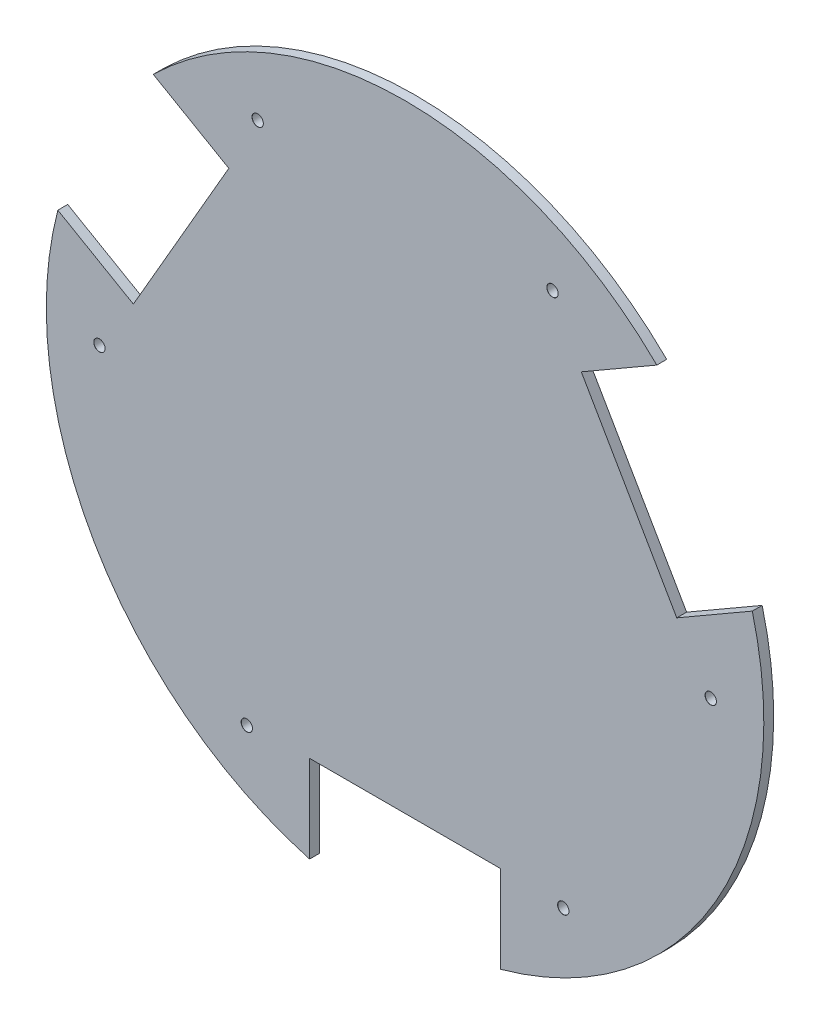
ISO-10303-21;
HEADER;
FILE_DESCRIPTION(('STEP AP214'),'2;1');
FILE_NAME('part.step','',(''),(''),'','','');
FILE_SCHEMA(('AUTOMOTIVE_DESIGN { 1 0 10303 214 1 1 1 1 }'));
ENDSEC;
DATA;
#1=APPLICATION_CONTEXT('core data for automotive mechanical design processes');
#2=APPLICATION_PROTOCOL_DEFINITION('international standard','automotive_design',2000,#1);
#3=PRODUCT_CONTEXT('',#1,'mechanical');
#4=PRODUCT('Part','Part','',(#3));
#5=PRODUCT_RELATED_PRODUCT_CATEGORY('part','',(#4));
#6=PRODUCT_DEFINITION_FORMATION('','',#4);
#7=PRODUCT_DEFINITION_CONTEXT('part definition',#1,'design');
#8=PRODUCT_DEFINITION('design','',#6,#7);
#9=PRODUCT_DEFINITION_SHAPE('','',#8);
#10=(LENGTH_UNIT() NAMED_UNIT(*) SI_UNIT(.MILLI.,.METRE.));
#11=(NAMED_UNIT(*) PLANE_ANGLE_UNIT() SI_UNIT($,.RADIAN.));
#12=(NAMED_UNIT(*) SI_UNIT($,.STERADIAN.) SOLID_ANGLE_UNIT());
#13=UNCERTAINTY_MEASURE_WITH_UNIT(LENGTH_MEASURE(1.E-05),#10,'distance_accuracy_value','');
#14=(GEOMETRIC_REPRESENTATION_CONTEXT(3) GLOBAL_UNCERTAINTY_ASSIGNED_CONTEXT((#13)) GLOBAL_UNIT_ASSIGNED_CONTEXT((#10,
#11,#12)) REPRESENTATION_CONTEXT('',''));
#15=CARTESIAN_POINT('',(0.,0.,0.));
#16=DIRECTION('',(0.,0.,1.));
#17=DIRECTION('',(1.,0.,0.));
#18=AXIS2_PLACEMENT_3D('',#15,#16,#17);
#19=CARTESIAN_POINT('',(0.,0.,3.));
#20=DIRECTION('',(0.,0.,-1.));
#21=DIRECTION('',(-1.,0.,0.));
#22=AXIS2_PLACEMENT_3D('',#19,#20,#21);
#23=CYLINDRICAL_SURFACE('',#22,109.);
#24=CARTESIAN_POINT('',(0.,0.,0.));
#25=DIRECTION('',(0.,0.,1.));
#26=DIRECTION('',(1.,0.,0.));
#27=AXIS2_PLACEMENT_3D('',#24,#25,#26);
#28=CIRCLE('',#27,109.);
#29=CARTESIAN_POINT('',(-105.494505328619,27.4209654365062,0.));
#30=VERTEX_POINT('',#29);
#31=CARTESIAN_POINT('',(-29.,-105.07140429251,0.));
#32=VERTEX_POINT('',#31);
#33=EDGE_CURVE('E245',#30,#32,#28,.T.);
#34=ORIENTED_EDGE('',*,*,#33,.T.);
#35=DIRECTION('',(0.,0.,-1.));
#36=VECTOR('',#35,1.);
#37=CARTESIAN_POINT('',(-29.,-105.07140429251,3.));
#38=LINE('',#37,#36);
#39=CARTESIAN_POINT('',(-29.,-105.07140429251,3.));
#40=VERTEX_POINT('',#39);
#41=EDGE_CURVE('E143',#32,#40,#38,.F.);
#42=ORIENTED_EDGE('',*,*,#41,.T.);
#43=CARTESIAN_POINT('',(0.,0.,3.));
#44=DIRECTION('',(0.,0.,1.));
#45=DIRECTION('',(1.,0.,0.));
#46=AXIS2_PLACEMENT_3D('',#43,#44,#45);
#47=CIRCLE('',#46,109.);
#48=CARTESIAN_POINT('',(-105.494505328619,27.4209654365062,3.));
#49=VERTEX_POINT('',#48);
#50=EDGE_CURVE('E239',#49,#40,#47,.T.);
#51=ORIENTED_EDGE('',*,*,#50,.F.);
#52=DIRECTION('',(0.,0.,-1.));
#53=VECTOR('',#52,1.);
#54=CARTESIAN_POINT('',(-105.494505328619,27.4209654365062,3.));
#55=LINE('',#54,#53);
#56=EDGE_CURVE('E220',#49,#30,#55,.T.);
#57=ORIENTED_EDGE('',*,*,#56,.T.);
#58=EDGE_LOOP('',(#34,#42,#51,#57));
#59=FACE_BOUND('',#58,.T.);
#60=ADVANCED_FACE('F38',(#59),#23,.T.);
#61=CARTESIAN_POINT('',(76.4945053286188,77.6504388560033,0.));
#62=VERTEX_POINT('',#61);
#63=CARTESIAN_POINT('',(-76.4945053286185,77.6504388560036,0.));
#64=VERTEX_POINT('',#63);
#65=EDGE_CURVE('E240',#62,#64,#28,.T.);
#66=ORIENTED_EDGE('',*,*,#65,.T.);
#67=DIRECTION('',(0.,0.,-1.));
#68=VECTOR('',#67,1.);
#69=CARTESIAN_POINT('',(-76.4945053286185,77.6504388560036,3.));
#70=LINE('',#69,#68);
#71=CARTESIAN_POINT('',(-76.4945053286185,77.6504388560036,3.));
#72=VERTEX_POINT('',#71);
#73=EDGE_CURVE('E224',#64,#72,#70,.F.);
#74=ORIENTED_EDGE('',*,*,#73,.T.);
#75=CARTESIAN_POINT('',(76.4945053286188,77.6504388560033,3.));
#76=VERTEX_POINT('',#75);
#77=EDGE_CURVE('E241',#76,#72,#47,.T.);
#78=ORIENTED_EDGE('',*,*,#77,.F.);
#79=DIRECTION('',(0.,0.,-1.));
#80=VECTOR('',#79,1.);
#81=CARTESIAN_POINT('',(76.4945053286188,77.6504388560033,3.));
#82=LINE('',#81,#80);
#83=EDGE_CURVE('E136',#76,#62,#82,.T.);
#84=ORIENTED_EDGE('',*,*,#83,.T.);
#85=EDGE_LOOP('',(#66,#74,#78,#84));
#86=FACE_BOUND('',#85,.T.);
#87=ADVANCED_FACE('F269',(#86),#23,.T.);
#88=CARTESIAN_POINT('',(29.,-105.07140429251,3.));
#89=VERTEX_POINT('',#88);
#90=CARTESIAN_POINT('',(105.494505328619,27.4209654365058,3.));
#91=VERTEX_POINT('',#90);
#92=EDGE_CURVE('E235',#89,#91,#47,.T.);
#93=ORIENTED_EDGE('',*,*,#92,.F.);
#94=DIRECTION('',(0.,0.,-1.));
#95=VECTOR('',#94,1.);
#96=CARTESIAN_POINT('',(29.,-105.07140429251,3.));
#97=LINE('',#96,#95);
#98=CARTESIAN_POINT('',(29.,-105.07140429251,0.));
#99=VERTEX_POINT('',#98);
#100=EDGE_CURVE('E228',#89,#99,#97,.T.);
#101=ORIENTED_EDGE('',*,*,#100,.T.);
#102=CARTESIAN_POINT('',(105.494505328619,27.4209654365058,0.));
#103=VERTEX_POINT('',#102);
#104=EDGE_CURVE('E234',#99,#103,#28,.T.);
#105=ORIENTED_EDGE('',*,*,#104,.T.);
#106=DIRECTION('',(0.,0.,-1.));
#107=VECTOR('',#106,1.);
#108=CARTESIAN_POINT('',(105.494505328619,27.4209654365058,3.));
#109=LINE('',#108,#107);
#110=EDGE_CURVE('E216',#103,#91,#109,.F.);
#111=ORIENTED_EDGE('',*,*,#110,.T.);
#112=EDGE_LOOP('',(#93,#101,#105,#111));
#113=FACE_BOUND('',#112,.T.);
#114=ADVANCED_FACE('F40',(#113),#23,.T.);
#115=CARTESIAN_POINT('',(0.,0.,3.));
#116=DIRECTION('',(0.,0.,1.));
#117=DIRECTION('',(1.,0.,0.));
#118=AXIS2_PLACEMENT_3D('',#115,#116,#117);
#119=PLANE('',#118);
#120=CARTESIAN_POINT('',(-44.781475350402,81.4281922733452,3.));
#121=DIRECTION('',(0.,0.,1.));
#122=DIRECTION('',(1.,0.,0.));
#123=AXIS2_PLACEMENT_3D('',#120,#121,#122);
#124=CIRCLE('',#123,1.725);
#125=CARTESIAN_POINT('',(-43.056475350402,81.4281922733452,3.));
#126=VERTEX_POINT('',#125);
#127=EDGE_CURVE('E474',#126,#126,#124,.T.);
#128=ORIENTED_EDGE('',*,*,#127,.F.);
#129=EDGE_LOOP('',(#128));
#130=FACE_BOUND('',#129,.T.);
#131=CARTESIAN_POINT('',(-92.8600927692787,-1.84641585381712,3.));
#132=DIRECTION('',(0.,0.,1.));
#133=DIRECTION('',(1.,0.,0.));
#134=AXIS2_PLACEMENT_3D('',#131,#132,#133);
#135=CIRCLE('',#134,1.725);
#136=CARTESIAN_POINT('',(-91.1350927692787,-1.84641585381712,3.));
#137=VERTEX_POINT('',#136);
#138=EDGE_CURVE('E484',#137,#137,#135,.T.);
#139=ORIENTED_EDGE('',*,*,#138,.F.);
#140=EDGE_LOOP('',(#139));
#141=FACE_BOUND('',#140,.T.);
#142=CARTESIAN_POINT('',(92.8697371447804,-1.86310106037225,3.));
#143=DIRECTION('',(0.,0.,1.));
#144=DIRECTION('',(1.,0.,0.));
#145=AXIS2_PLACEMENT_3D('',#142,#143,#144);
#146=CIRCLE('',#145,1.725);
#147=CARTESIAN_POINT('',(94.5947371447804,-1.86310106037225,3.));
#148=VERTEX_POINT('',#147);
#149=EDGE_CURVE('E496',#148,#148,#146,.T.);
#150=ORIENTED_EDGE('',*,*,#149,.F.);
#151=EDGE_LOOP('',(#150));
#152=FACE_BOUND('',#151,.T.);
#153=CARTESIAN_POINT('',(44.7911197259025,81.4115070667894,3.));
#154=DIRECTION('',(0.,0.,1.));
#155=DIRECTION('',(1.,0.,0.));
#156=AXIS2_PLACEMENT_3D('',#153,#154,#155);
#157=CIRCLE('',#156,1.725);
#158=CARTESIAN_POINT('',(46.5161197259025,81.4115070667894,3.));
#159=VERTEX_POINT('',#158);
#160=EDGE_CURVE('E508',#159,#159,#157,.T.);
#161=ORIENTED_EDGE('',*,*,#160,.F.);
#162=EDGE_LOOP('',(#161));
#163=FACE_BOUND('',#162,.T.);
#164=CARTESIAN_POINT('',(-48.0882450438719,-79.4269012760708,3.));
#165=DIRECTION('',(0.,0.,1.));
#166=DIRECTION('',(1.,0.,0.));
#167=AXIS2_PLACEMENT_3D('',#164,#165,#166);
#168=CIRCLE('',#167,1.725);
#169=CARTESIAN_POINT('',(-46.3632450438719,-79.4269012760708,3.));
#170=VERTEX_POINT('',#169);
#171=EDGE_CURVE('E520',#170,#170,#168,.T.);
#172=ORIENTED_EDGE('',*,*,#171,.F.);
#173=EDGE_LOOP('',(#172));
#174=FACE_BOUND('',#173,.T.);
#175=CARTESIAN_POINT('',(48.0689897938831,-79.4269012760708,3.));
#176=DIRECTION('',(0.,0.,1.));
#177=DIRECTION('',(1.,0.,0.));
#178=AXIS2_PLACEMENT_3D('',#175,#176,#177);
#179=CIRCLE('',#178,1.725);
#180=CARTESIAN_POINT('',(49.7939897938831,-79.4269012760708,3.));
#181=VERTEX_POINT('',#180);
#182=EDGE_CURVE('E532',#181,#181,#179,.T.);
#183=ORIENTED_EDGE('',*,*,#182,.F.);
#184=EDGE_LOOP('',(#183));
#185=FACE_BOUND('',#184,.T.);
#186=DIRECTION('',(0.,-1.,0.));
#187=VECTOR('',#186,1.);
#188=CARTESIAN_POINT('',(-29.,-120.989097303289,3.));
#189=LINE('',#188,#187);
#190=CARTESIAN_POINT('',(-29.,-78.5714042925096,3.));
#191=VERTEX_POINT('',#190);
#192=EDGE_CURVE('E157',#191,#40,#189,.T.);
#193=ORIENTED_EDGE('',*,*,#192,.F.);
#194=DIRECTION('',(-1.,0.,0.));
#195=VECTOR('',#194,1.);
#196=CARTESIAN_POINT('',(-29.,-78.5714042925096,3.));
#197=LINE('',#196,#195);
#198=CARTESIAN_POINT('',(29.,-78.5714042925096,3.));
#199=VERTEX_POINT('',#198);
#200=EDGE_CURVE('E132',#199,#191,#197,.T.);
#201=ORIENTED_EDGE('',*,*,#200,.F.);
#202=DIRECTION('',(0.,1.,0.));
#203=VECTOR('',#202,1.);
#204=CARTESIAN_POINT('',(29.,-120.989097303289,3.));
#205=LINE('',#204,#203);
#206=EDGE_CURVE('E160',#89,#199,#205,.T.);
#207=ORIENTED_EDGE('',*,*,#206,.F.);
#208=ORIENTED_EDGE('',*,*,#92,.T.);
#209=DIRECTION('',(0.86602540378443,0.500000000000015,0.));
#210=VECTOR('',#209,1.);
#211=CARTESIAN_POINT('',(119.279631845596,35.3798119418958,3.));
#212=LINE('',#211,#210);
#213=CARTESIAN_POINT('',(82.5448321283311,14.1709654365053,3.));
#214=VERTEX_POINT('',#213);
#215=EDGE_CURVE('E198',#214,#91,#212,.T.);
#216=ORIENTED_EDGE('',*,*,#215,.F.);
#217=DIRECTION('',(0.499999999999992,-0.866025403784443,0.));
#218=VECTOR('',#217,1.);
#219=CARTESIAN_POINT('',(82.5448321283311,14.1709654365053,3.));
#220=LINE('',#219,#218);
#221=CARTESIAN_POINT('',(53.5448321283316,64.400438856003,3.));
#222=VERTEX_POINT('',#221);
#223=EDGE_CURVE('E193',#222,#214,#220,.T.);
#224=ORIENTED_EDGE('',*,*,#223,.F.);
#225=DIRECTION('',(-0.86602540378443,-0.500000000000015,0.));
#226=VECTOR('',#225,1.);
#227=CARTESIAN_POINT('',(90.2796318455955,85.6092853613932,3.));
#228=LINE('',#227,#226);
#229=EDGE_CURVE('E201',#76,#222,#228,.T.);
#230=ORIENTED_EDGE('',*,*,#229,.F.);
#231=ORIENTED_EDGE('',*,*,#77,.T.);
#232=DIRECTION('',(-0.866025403784442,0.499999999999994,0.));
#233=VECTOR('',#232,1.);
#234=CARTESIAN_POINT('',(-90.2796318455954,85.6092853613932,3.));
#235=LINE('',#234,#233);
#236=CARTESIAN_POINT('',(-53.5448321283307,64.4004388560038,3.));
#237=VERTEX_POINT('',#236);
#238=EDGE_CURVE('E174',#237,#72,#235,.T.);
#239=ORIENTED_EDGE('',*,*,#238,.F.);
#240=DIRECTION('',(0.500000000000004,0.866025403784436,0.));
#241=VECTOR('',#240,1.);
#242=CARTESIAN_POINT('',(-53.5448321283307,64.4004388560038,3.));
#243=LINE('',#242,#241);
#244=CARTESIAN_POINT('',(-82.5448321283309,14.1709654365065,3.));
#245=VERTEX_POINT('',#244);
#246=EDGE_CURVE('E170',#245,#237,#243,.T.);
#247=ORIENTED_EDGE('',*,*,#246,.F.);
#248=DIRECTION('',(0.866025403784442,-0.499999999999994,0.));
#249=VECTOR('',#248,1.);
#250=CARTESIAN_POINT('',(-119.279631845595,35.3798119418957,3.));
#251=LINE('',#250,#249);
#252=EDGE_CURVE('E177',#49,#245,#251,.T.);
#253=ORIENTED_EDGE('',*,*,#252,.F.);
#254=ORIENTED_EDGE('',*,*,#50,.T.);
#255=EDGE_LOOP('',(#193,#201,#207,#208,#216,#224,#230,#231,#239,#247,#253,#254));
#256=FACE_BOUND('',#255,.T.);
#257=ADVANCED_FACE('F264',(#130,#141,#152,#163,#174,#185,#256),#119,.T.);
#258=CARTESIAN_POINT('',(0.,0.,0.));
#259=DIRECTION('',(0.,0.,1.));
#260=DIRECTION('',(1.,0.,0.));
#261=AXIS2_PLACEMENT_3D('',#258,#259,#260);
#262=PLANE('',#261);
#263=CARTESIAN_POINT('',(-44.781475350402,81.4281922733452,0.));
#264=DIRECTION('',(0.,0.,1.));
#265=DIRECTION('',(1.,0.,0.));
#266=AXIS2_PLACEMENT_3D('',#263,#264,#265);
#267=CIRCLE('',#266,1.69999999999999);
#268=CARTESIAN_POINT('',(-43.081475350402,81.4281922733452,0.));
#269=VERTEX_POINT('',#268);
#270=EDGE_CURVE('E478',#269,#269,#267,.T.);
#271=ORIENTED_EDGE('',*,*,#270,.T.);
#272=EDGE_LOOP('',(#271));
#273=FACE_BOUND('',#272,.T.);
#274=CARTESIAN_POINT('',(-92.8600927692787,-1.84641585381712,0.));
#275=DIRECTION('',(0.,0.,1.));
#276=DIRECTION('',(1.,0.,0.));
#277=AXIS2_PLACEMENT_3D('',#274,#275,#276);
#278=CIRCLE('',#277,1.69999999999999);
#279=CARTESIAN_POINT('',(-91.1600927692787,-1.84641585381712,0.));
#280=VERTEX_POINT('',#279);
#281=EDGE_CURVE('E492',#280,#280,#278,.T.);
#282=ORIENTED_EDGE('',*,*,#281,.T.);
#283=EDGE_LOOP('',(#282));
#284=FACE_BOUND('',#283,.T.);
#285=CARTESIAN_POINT('',(92.8697371447804,-1.86310106037225,0.));
#286=DIRECTION('',(0.,0.,1.));
#287=DIRECTION('',(1.,0.,0.));
#288=AXIS2_PLACEMENT_3D('',#285,#286,#287);
#289=CIRCLE('',#288,1.69999999999999);
#290=CARTESIAN_POINT('',(94.5697371447804,-1.86310106037225,0.));
#291=VERTEX_POINT('',#290);
#292=EDGE_CURVE('E504',#291,#291,#289,.T.);
#293=ORIENTED_EDGE('',*,*,#292,.T.);
#294=EDGE_LOOP('',(#293));
#295=FACE_BOUND('',#294,.T.);
#296=CARTESIAN_POINT('',(44.7911197259025,81.4115070667894,0.));
#297=DIRECTION('',(0.,0.,1.));
#298=DIRECTION('',(1.,0.,0.));
#299=AXIS2_PLACEMENT_3D('',#296,#297,#298);
#300=CIRCLE('',#299,1.69999999999999);
#301=CARTESIAN_POINT('',(46.4911197259025,81.4115070667894,0.));
#302=VERTEX_POINT('',#301);
#303=EDGE_CURVE('E516',#302,#302,#300,.T.);
#304=ORIENTED_EDGE('',*,*,#303,.T.);
#305=EDGE_LOOP('',(#304));
#306=FACE_BOUND('',#305,.T.);
#307=CARTESIAN_POINT('',(-48.0882450438719,-79.4269012760708,0.));
#308=DIRECTION('',(0.,0.,1.));
#309=DIRECTION('',(1.,0.,0.));
#310=AXIS2_PLACEMENT_3D('',#307,#308,#309);
#311=CIRCLE('',#310,1.69999999999999);
#312=CARTESIAN_POINT('',(-46.3882450438719,-79.4269012760708,0.));
#313=VERTEX_POINT('',#312);
#314=EDGE_CURVE('E528',#313,#313,#311,.T.);
#315=ORIENTED_EDGE('',*,*,#314,.T.);
#316=EDGE_LOOP('',(#315));
#317=FACE_BOUND('',#316,.T.);
#318=CARTESIAN_POINT('',(48.0689897938831,-79.4269012760708,0.));
#319=DIRECTION('',(0.,0.,1.));
#320=DIRECTION('',(1.,0.,0.));
#321=AXIS2_PLACEMENT_3D('',#318,#319,#320);
#322=CIRCLE('',#321,1.69999999999999);
#323=CARTESIAN_POINT('',(49.7689897938831,-79.4269012760708,0.));
#324=VERTEX_POINT('',#323);
#325=EDGE_CURVE('E202',#324,#324,#322,.T.);
#326=ORIENTED_EDGE('',*,*,#325,.T.);
#327=EDGE_LOOP('',(#326));
#328=FACE_BOUND('',#327,.T.);
#329=DIRECTION('',(-1.,0.,0.));
#330=VECTOR('',#329,1.);
#331=CARTESIAN_POINT('',(-29.,-78.5714042925096,0.));
#332=LINE('',#331,#330);
#333=CARTESIAN_POINT('',(29.,-78.5714042925096,0.));
#334=VERTEX_POINT('',#333);
#335=CARTESIAN_POINT('',(-29.,-78.5714042925096,0.));
#336=VERTEX_POINT('',#335);
#337=EDGE_CURVE('E54',#334,#336,#332,.T.);
#338=ORIENTED_EDGE('',*,*,#337,.T.);
#339=DIRECTION('',(0.,-1.,0.));
#340=VECTOR('',#339,1.);
#341=CARTESIAN_POINT('',(-29.,-120.989097303289,0.));
#342=LINE('',#341,#340);
#343=EDGE_CURVE('E140',#336,#32,#342,.T.);
#344=ORIENTED_EDGE('',*,*,#343,.T.);
#345=ORIENTED_EDGE('',*,*,#33,.F.);
#346=DIRECTION('',(0.866025403784442,-0.499999999999994,0.));
#347=VECTOR('',#346,1.);
#348=CARTESIAN_POINT('',(-14.4999999999993,-25.114736709748,0.));
#349=LINE('',#348,#347);
#350=CARTESIAN_POINT('',(-82.5448321283309,14.1709654365065,0.));
#351=VERTEX_POINT('',#350);
#352=EDGE_CURVE('E47',#30,#351,#349,.T.);
#353=ORIENTED_EDGE('',*,*,#352,.T.);
#354=DIRECTION('',(0.500000000000004,0.866025403784436,0.));
#355=VECTOR('',#354,1.);
#356=CARTESIAN_POINT('',(-53.5448321283307,64.4004388560038,0.));
#357=LINE('',#356,#355);
#358=CARTESIAN_POINT('',(-53.5448321283307,64.4004388560038,0.));
#359=VERTEX_POINT('',#358);
#360=EDGE_CURVE('E62',#351,#359,#357,.T.);
#361=ORIENTED_EDGE('',*,*,#360,.T.);
#362=DIRECTION('',(-0.866025403784442,0.499999999999994,0.));
#363=VECTOR('',#362,1.);
#364=CARTESIAN_POINT('',(-90.2796318455954,85.6092853613932,0.));
#365=LINE('',#364,#363);
#366=EDGE_CURVE('E166',#359,#64,#365,.T.);
#367=ORIENTED_EDGE('',*,*,#366,.T.);
#368=ORIENTED_EDGE('',*,*,#65,.F.);
#369=DIRECTION('',(-0.86602540378443,-0.500000000000015,0.));
#370=VECTOR('',#369,1.);
#371=CARTESIAN_POINT('',(-14.4999999999994,25.1147367097467,0.));
#372=LINE('',#371,#370);
#373=CARTESIAN_POINT('',(53.5448321283315,64.400438856003,0.));
#374=VERTEX_POINT('',#373);
#375=EDGE_CURVE('E246',#62,#374,#372,.T.);
#376=ORIENTED_EDGE('',*,*,#375,.T.);
#377=DIRECTION('',(0.499999999999992,-0.866025403784443,0.));
#378=VECTOR('',#377,1.);
#379=CARTESIAN_POINT('',(82.5448321283311,14.1709654365053,0.));
#380=LINE('',#379,#378);
#381=CARTESIAN_POINT('',(82.5448321283311,14.1709654365053,0.));
#382=VERTEX_POINT('',#381);
#383=EDGE_CURVE('E192',#374,#382,#380,.T.);
#384=ORIENTED_EDGE('',*,*,#383,.T.);
#385=DIRECTION('',(0.86602540378443,0.500000000000015,0.));
#386=VECTOR('',#385,1.);
#387=CARTESIAN_POINT('',(119.279631845596,35.3798119418958,0.));
#388=LINE('',#387,#386);
#389=EDGE_CURVE('E188',#382,#103,#388,.T.);
#390=ORIENTED_EDGE('',*,*,#389,.T.);
#391=ORIENTED_EDGE('',*,*,#104,.F.);
#392=DIRECTION('',(0.,1.,0.));
#393=VECTOR('',#392,1.);
#394=CARTESIAN_POINT('',(29.,0.,0.));
#395=LINE('',#394,#393);
#396=EDGE_CURVE('E11',#99,#334,#395,.T.);
#397=ORIENTED_EDGE('',*,*,#396,.T.);
#398=EDGE_LOOP('',(#338,#344,#345,#353,#361,#367,#368,#376,#384,#390,#391,#397));
#399=FACE_BOUND('',#398,.T.);
#400=ADVANCED_FACE('F149',(#273,#284,#295,#306,#317,#328,#399),#262,.F.);
#401=CARTESIAN_POINT('',(119.279631845596,35.3798119418958,0.));
#402=DIRECTION('',(0.500000000000015,-0.86602540378443,0.));
#403=DIRECTION('',(0.86602540378443,0.500000000000015,0.));
#404=AXIS2_PLACEMENT_3D('',#401,#402,#403);
#405=PLANE('',#404);
#406=ORIENTED_EDGE('',*,*,#389,.F.);
#407=DIRECTION('',(0.,0.,1.));
#408=VECTOR('',#407,1.);
#409=CARTESIAN_POINT('',(82.5448321283311,14.1709654365053,0.));
#410=LINE('',#409,#408);
#411=EDGE_CURVE('E178',#382,#214,#410,.T.);
#412=ORIENTED_EDGE('',*,*,#411,.T.);
#413=ORIENTED_EDGE('',*,*,#215,.T.);
#414=ORIENTED_EDGE('',*,*,#110,.F.);
#415=EDGE_LOOP('',(#406,#412,#413,#414));
#416=FACE_BOUND('',#415,.T.);
#417=ADVANCED_FACE('F286',(#416),#405,.F.);
#418=CARTESIAN_POINT('',(90.2796318455955,85.6092853613932,0.));
#419=DIRECTION('',(-0.500000000000015,0.86602540378443,0.));
#420=DIRECTION('',(-0.86602540378443,-0.500000000000015,0.));
#421=AXIS2_PLACEMENT_3D('',#418,#419,#420);
#422=PLANE('',#421);
#423=ORIENTED_EDGE('',*,*,#229,.T.);
#424=DIRECTION('',(0.,0.,1.));
#425=VECTOR('',#424,1.);
#426=CARTESIAN_POINT('',(53.5448321283316,64.400438856003,0.));
#427=LINE('',#426,#425);
#428=EDGE_CURVE('E197',#374,#222,#427,.T.);
#429=ORIENTED_EDGE('',*,*,#428,.F.);
#430=ORIENTED_EDGE('',*,*,#375,.F.);
#431=ORIENTED_EDGE('',*,*,#83,.F.);
#432=EDGE_LOOP('',(#423,#429,#430,#431));
#433=FACE_BOUND('',#432,.T.);
#434=ADVANCED_FACE('F278',(#433),#422,.F.);
#435=CARTESIAN_POINT('',(82.5448321283311,14.1709654365053,0.));
#436=DIRECTION('',(-0.866025403784443,-0.499999999999992,0.));
#437=DIRECTION('',(0.499999999999992,-0.866025403784444,0.));
#438=AXIS2_PLACEMENT_3D('',#435,#436,#437);
#439=PLANE('',#438);
#440=ORIENTED_EDGE('',*,*,#223,.T.);
#441=ORIENTED_EDGE('',*,*,#411,.F.);
#442=ORIENTED_EDGE('',*,*,#383,.F.);
#443=ORIENTED_EDGE('',*,*,#428,.T.);
#444=EDGE_LOOP('',(#440,#441,#442,#443));
#445=FACE_BOUND('',#444,.T.);
#446=ADVANCED_FACE('F280',(#445),#439,.F.);
#447=CARTESIAN_POINT('',(-90.2796318455954,85.6092853613932,0.));
#448=DIRECTION('',(0.499999999999994,0.866025403784442,0.));
#449=DIRECTION('',(-0.866025403784442,0.499999999999994,0.));
#450=AXIS2_PLACEMENT_3D('',#447,#448,#449);
#451=PLANE('',#450);
#452=ORIENTED_EDGE('',*,*,#366,.F.);
#453=DIRECTION('',(0.,0.,1.));
#454=VECTOR('',#453,1.);
#455=CARTESIAN_POINT('',(-53.5448321283307,64.4004388560038,0.));
#456=LINE('',#455,#454);
#457=EDGE_CURVE('E161',#359,#237,#456,.T.);
#458=ORIENTED_EDGE('',*,*,#457,.T.);
#459=ORIENTED_EDGE('',*,*,#238,.T.);
#460=ORIENTED_EDGE('',*,*,#73,.F.);
#461=EDGE_LOOP('',(#452,#458,#459,#460));
#462=FACE_BOUND('',#461,.T.);
#463=ADVANCED_FACE('F273',(#462),#451,.F.);
#464=CARTESIAN_POINT('',(-119.279631845595,35.3798119418957,0.));
#465=DIRECTION('',(-0.499999999999994,-0.866025403784442,0.));
#466=DIRECTION('',(0.866025403784442,-0.499999999999994,0.));
#467=AXIS2_PLACEMENT_3D('',#464,#465,#466);
#468=PLANE('',#467);
#469=ORIENTED_EDGE('',*,*,#252,.T.);
#470=DIRECTION('',(0.,0.,1.));
#471=VECTOR('',#470,1.);
#472=CARTESIAN_POINT('',(-82.5448321283309,14.1709654365065,0.));
#473=LINE('',#472,#471);
#474=EDGE_CURVE('E173',#351,#245,#473,.T.);
#475=ORIENTED_EDGE('',*,*,#474,.F.);
#476=ORIENTED_EDGE('',*,*,#352,.F.);
#477=ORIENTED_EDGE('',*,*,#56,.F.);
#478=EDGE_LOOP('',(#469,#475,#476,#477));
#479=FACE_BOUND('',#478,.T.);
#480=ADVANCED_FACE('F252',(#479),#468,.F.);
#481=CARTESIAN_POINT('',(-53.5448321283307,64.4004388560038,0.));
#482=DIRECTION('',(0.866025403784436,-0.500000000000004,0.));
#483=DIRECTION('',(0.500000000000004,0.866025403784436,0.));
#484=AXIS2_PLACEMENT_3D('',#481,#482,#483);
#485=PLANE('',#484);
#486=ORIENTED_EDGE('',*,*,#246,.T.);
#487=ORIENTED_EDGE('',*,*,#457,.F.);
#488=ORIENTED_EDGE('',*,*,#360,.F.);
#489=ORIENTED_EDGE('',*,*,#474,.T.);
#490=EDGE_LOOP('',(#486,#487,#488,#489));
#491=FACE_BOUND('',#490,.T.);
#492=ADVANCED_FACE('F298',(#491),#485,.F.);
#493=CARTESIAN_POINT('',(-29.,-120.989097303289,0.));
#494=DIRECTION('',(-1.,0.,0.));
#495=DIRECTION('',(0.,0.,1.));
#496=AXIS2_PLACEMENT_3D('',#493,#494,#495);
#497=PLANE('',#496);
#498=ORIENTED_EDGE('',*,*,#343,.F.);
#499=DIRECTION('',(0.,0.,1.));
#500=VECTOR('',#499,1.);
#501=CARTESIAN_POINT('',(-29.,-78.5714042925096,0.));
#502=LINE('',#501,#500);
#503=EDGE_CURVE('E128',#336,#191,#502,.T.);
#504=ORIENTED_EDGE('',*,*,#503,.T.);
#505=ORIENTED_EDGE('',*,*,#192,.T.);
#506=ORIENTED_EDGE('',*,*,#41,.F.);
#507=EDGE_LOOP('',(#498,#504,#505,#506));
#508=FACE_BOUND('',#507,.T.);
#509=ADVANCED_FACE('F141',(#508),#497,.F.);
#510=CARTESIAN_POINT('',(29.,-120.989097303289,0.));
#511=DIRECTION('',(1.,0.,0.));
#512=DIRECTION('',(0.,0.,-1.));
#513=AXIS2_PLACEMENT_3D('',#510,#511,#512);
#514=PLANE('',#513);
#515=ORIENTED_EDGE('',*,*,#206,.T.);
#516=DIRECTION('',(0.,0.,1.));
#517=VECTOR('',#516,1.);
#518=CARTESIAN_POINT('',(29.,-78.5714042925096,0.));
#519=LINE('',#518,#517);
#520=EDGE_CURVE('E137',#334,#199,#519,.T.);
#521=ORIENTED_EDGE('',*,*,#520,.F.);
#522=ORIENTED_EDGE('',*,*,#396,.F.);
#523=ORIENTED_EDGE('',*,*,#100,.F.);
#524=EDGE_LOOP('',(#515,#521,#522,#523));
#525=FACE_BOUND('',#524,.T.);
#526=ADVANCED_FACE('F289',(#525),#514,.F.);
#527=CARTESIAN_POINT('',(-29.,-78.5714042925096,0.));
#528=DIRECTION('',(0.,1.,0.));
#529=DIRECTION('',(0.,0.,1.));
#530=AXIS2_PLACEMENT_3D('',#527,#528,#529);
#531=PLANE('',#530);
#532=ORIENTED_EDGE('',*,*,#200,.T.);
#533=ORIENTED_EDGE('',*,*,#503,.F.);
#534=ORIENTED_EDGE('',*,*,#337,.F.);
#535=ORIENTED_EDGE('',*,*,#520,.T.);
#536=EDGE_LOOP('',(#532,#533,#534,#535));
#537=FACE_BOUND('',#536,.T.);
#538=ADVANCED_FACE('F130',(#537),#531,.F.);
#539=CARTESIAN_POINT('',(48.0689897938831,-79.4269012760708,3.));
#540=DIRECTION('',(0.,0.,1.));
#541=DIRECTION('',(1.,0.,0.));
#542=AXIS2_PLACEMENT_3D('',#539,#540,#541);
#543=CYLINDRICAL_SURFACE('',#542,1.69999999999999);
#544=ORIENTED_EDGE('',*,*,#325,.F.);
#545=EDGE_LOOP('',(#544));
#546=FACE_BOUND('',#545,.T.);
#547=CARTESIAN_POINT('',(48.0689897938831,-79.4269012760708,2.975));
#548=DIRECTION('',(0.,0.,1.));
#549=DIRECTION('',(1.,0.,0.));
#550=AXIS2_PLACEMENT_3D('',#547,#548,#549);
#551=CIRCLE('',#550,1.7);
#552=CARTESIAN_POINT('',(49.7689897938831,-79.4269012760708,2.975));
#553=VERTEX_POINT('',#552);
#554=EDGE_CURVE('E536',#553,#553,#551,.T.);
#555=ORIENTED_EDGE('',*,*,#554,.T.);
#556=EDGE_LOOP('',(#555));
#557=FACE_BOUND('',#556,.T.);
#558=ADVANCED_FACE('F296',(#546,#557),#543,.F.);
#559=CARTESIAN_POINT('',(48.0689897938831,-79.4269012760708,3.));
#560=DIRECTION('',(0.,0.,1.));
#561=DIRECTION('',(1.,0.,0.));
#562=AXIS2_PLACEMENT_3D('',#559,#560,#561);
#563=CONICAL_SURFACE('',#562,1.725,0.785398163397483);
#564=ORIENTED_EDGE('',*,*,#554,.F.);
#565=EDGE_LOOP('',(#564));
#566=FACE_BOUND('',#565,.T.);
#567=ORIENTED_EDGE('',*,*,#182,.T.);
#568=EDGE_LOOP('',(#567));
#569=FACE_BOUND('',#568,.T.);
#570=ADVANCED_FACE('F356',(#566,#569),#563,.F.);
#571=CARTESIAN_POINT('',(-48.0882450438719,-79.4269012760708,3.));
#572=DIRECTION('',(0.,0.,1.));
#573=DIRECTION('',(1.,0.,0.));
#574=AXIS2_PLACEMENT_3D('',#571,#572,#573);
#575=CYLINDRICAL_SURFACE('',#574,1.69999999999999);
#576=ORIENTED_EDGE('',*,*,#314,.F.);
#577=EDGE_LOOP('',(#576));
#578=FACE_BOUND('',#577,.T.);
#579=CARTESIAN_POINT('',(-48.0882450438719,-79.4269012760708,2.975));
#580=DIRECTION('',(0.,0.,1.));
#581=DIRECTION('',(1.,0.,0.));
#582=AXIS2_PLACEMENT_3D('',#579,#580,#581);
#583=CIRCLE('',#582,1.7);
#584=CARTESIAN_POINT('',(-46.3882450438719,-79.4269012760708,2.975));
#585=VERTEX_POINT('',#584);
#586=EDGE_CURVE('E524',#585,#585,#583,.T.);
#587=ORIENTED_EDGE('',*,*,#586,.T.);
#588=EDGE_LOOP('',(#587));
#589=FACE_BOUND('',#588,.T.);
#590=ADVANCED_FACE('F366',(#578,#589),#575,.F.);
#591=CARTESIAN_POINT('',(-48.0882450438719,-79.4269012760708,3.));
#592=DIRECTION('',(0.,0.,1.));
#593=DIRECTION('',(1.,0.,0.));
#594=AXIS2_PLACEMENT_3D('',#591,#592,#593);
#595=CONICAL_SURFACE('',#594,1.725,0.785398163397483);
#596=ORIENTED_EDGE('',*,*,#586,.F.);
#597=EDGE_LOOP('',(#596));
#598=FACE_BOUND('',#597,.T.);
#599=ORIENTED_EDGE('',*,*,#171,.T.);
#600=EDGE_LOOP('',(#599));
#601=FACE_BOUND('',#600,.T.);
#602=ADVANCED_FACE('F375',(#598,#601),#595,.F.);
#603=CARTESIAN_POINT('',(44.7911197259025,81.4115070667894,3.));
#604=DIRECTION('',(0.,0.,1.));
#605=DIRECTION('',(1.,0.,0.));
#606=AXIS2_PLACEMENT_3D('',#603,#604,#605);
#607=CYLINDRICAL_SURFACE('',#606,1.69999999999999);
#608=ORIENTED_EDGE('',*,*,#303,.F.);
#609=EDGE_LOOP('',(#608));
#610=FACE_BOUND('',#609,.T.);
#611=CARTESIAN_POINT('',(44.7911197259025,81.4115070667894,2.975));
#612=DIRECTION('',(0.,0.,1.));
#613=DIRECTION('',(1.,0.,0.));
#614=AXIS2_PLACEMENT_3D('',#611,#612,#613);
#615=CIRCLE('',#614,1.7);
#616=CARTESIAN_POINT('',(46.4911197259025,81.4115070667894,2.975));
#617=VERTEX_POINT('',#616);
#618=EDGE_CURVE('E512',#617,#617,#615,.T.);
#619=ORIENTED_EDGE('',*,*,#618,.T.);
#620=EDGE_LOOP('',(#619));
#621=FACE_BOUND('',#620,.T.);
#622=ADVANCED_FACE('F384',(#610,#621),#607,.F.);
#623=CARTESIAN_POINT('',(44.7911197259025,81.4115070667894,3.));
#624=DIRECTION('',(0.,0.,1.));
#625=DIRECTION('',(1.,0.,0.));
#626=AXIS2_PLACEMENT_3D('',#623,#624,#625);
#627=CONICAL_SURFACE('',#626,1.725,0.785398163397483);
#628=ORIENTED_EDGE('',*,*,#618,.F.);
#629=EDGE_LOOP('',(#628));
#630=FACE_BOUND('',#629,.T.);
#631=ORIENTED_EDGE('',*,*,#160,.T.);
#632=EDGE_LOOP('',(#631));
#633=FACE_BOUND('',#632,.T.);
#634=ADVANCED_FACE('F395',(#630,#633),#627,.F.);
#635=CARTESIAN_POINT('',(92.8697371447804,-1.86310106037225,3.));
#636=DIRECTION('',(0.,0.,1.));
#637=DIRECTION('',(1.,0.,0.));
#638=AXIS2_PLACEMENT_3D('',#635,#636,#637);
#639=CYLINDRICAL_SURFACE('',#638,1.69999999999999);
#640=ORIENTED_EDGE('',*,*,#292,.F.);
#641=EDGE_LOOP('',(#640));
#642=FACE_BOUND('',#641,.T.);
#643=CARTESIAN_POINT('',(92.8697371447804,-1.86310106037225,2.975));
#644=DIRECTION('',(0.,0.,1.));
#645=DIRECTION('',(1.,0.,0.));
#646=AXIS2_PLACEMENT_3D('',#643,#644,#645);
#647=CIRCLE('',#646,1.69999999999999);
#648=CARTESIAN_POINT('',(94.5697371447804,-1.86310106037225,2.975));
#649=VERTEX_POINT('',#648);
#650=EDGE_CURVE('E500',#649,#649,#647,.T.);
#651=ORIENTED_EDGE('',*,*,#650,.T.);
#652=EDGE_LOOP('',(#651));
#653=FACE_BOUND('',#652,.T.);
#654=ADVANCED_FACE('F402',(#642,#653),#639,.F.);
#655=CARTESIAN_POINT('',(92.8697371447804,-1.86310106037225,3.));
#656=DIRECTION('',(0.,0.,1.));
#657=DIRECTION('',(1.,0.,0.));
#658=AXIS2_PLACEMENT_3D('',#655,#656,#657);
#659=CONICAL_SURFACE('',#658,1.725,0.785398163397622);
#660=ORIENTED_EDGE('',*,*,#650,.F.);
#661=EDGE_LOOP('',(#660));
#662=FACE_BOUND('',#661,.T.);
#663=ORIENTED_EDGE('',*,*,#149,.T.);
#664=EDGE_LOOP('',(#663));
#665=FACE_BOUND('',#664,.T.);
#666=ADVANCED_FACE('F410',(#662,#665),#659,.F.);
#667=CARTESIAN_POINT('',(-92.8600927692787,-1.84641585381712,3.));
#668=DIRECTION('',(0.,0.,1.));
#669=DIRECTION('',(1.,0.,0.));
#670=AXIS2_PLACEMENT_3D('',#667,#668,#669);
#671=CYLINDRICAL_SURFACE('',#670,1.69999999999999);
#672=ORIENTED_EDGE('',*,*,#281,.F.);
#673=EDGE_LOOP('',(#672));
#674=FACE_BOUND('',#673,.T.);
#675=CARTESIAN_POINT('',(-92.8600927692787,-1.84641585381712,2.975));
#676=DIRECTION('',(0.,0.,1.));
#677=DIRECTION('',(1.,0.,0.));
#678=AXIS2_PLACEMENT_3D('',#675,#676,#677);
#679=CIRCLE('',#678,1.69999999999999);
#680=CARTESIAN_POINT('',(-91.1600927692787,-1.84641585381712,2.975));
#681=VERTEX_POINT('',#680);
#682=EDGE_CURVE('E488',#681,#681,#679,.T.);
#683=ORIENTED_EDGE('',*,*,#682,.T.);
#684=EDGE_LOOP('',(#683));
#685=FACE_BOUND('',#684,.T.);
#686=ADVANCED_FACE('F418',(#674,#685),#671,.F.);
#687=CARTESIAN_POINT('',(-92.8600927692787,-1.84641585381712,3.));
#688=DIRECTION('',(0.,0.,1.));
#689=DIRECTION('',(1.,0.,0.));
#690=AXIS2_PLACEMENT_3D('',#687,#688,#689);
#691=CONICAL_SURFACE('',#690,1.725,0.785398163397622);
#692=ORIENTED_EDGE('',*,*,#682,.F.);
#693=EDGE_LOOP('',(#692));
#694=FACE_BOUND('',#693,.T.);
#695=ORIENTED_EDGE('',*,*,#138,.T.);
#696=EDGE_LOOP('',(#695));
#697=FACE_BOUND('',#696,.T.);
#698=ADVANCED_FACE('F426',(#694,#697),#691,.F.);
#699=CARTESIAN_POINT('',(-44.781475350402,81.4281922733452,3.));
#700=DIRECTION('',(0.,0.,1.));
#701=DIRECTION('',(1.,0.,0.));
#702=AXIS2_PLACEMENT_3D('',#699,#700,#701);
#703=CYLINDRICAL_SURFACE('',#702,1.69999999999999);
#704=ORIENTED_EDGE('',*,*,#270,.F.);
#705=EDGE_LOOP('',(#704));
#706=FACE_BOUND('',#705,.T.);
#707=CARTESIAN_POINT('',(-44.781475350402,81.4281922733452,2.975));
#708=DIRECTION('',(0.,0.,1.));
#709=DIRECTION('',(1.,0.,0.));
#710=AXIS2_PLACEMENT_3D('',#707,#708,#709);
#711=CIRCLE('',#710,1.7);
#712=CARTESIAN_POINT('',(-43.081475350402,81.4281922733452,2.975));
#713=VERTEX_POINT('',#712);
#714=EDGE_CURVE('E472',#713,#713,#711,.T.);
#715=ORIENTED_EDGE('',*,*,#714,.T.);
#716=EDGE_LOOP('',(#715));
#717=FACE_BOUND('',#716,.T.);
#718=ADVANCED_FACE('F434',(#706,#717),#703,.F.);
#719=CARTESIAN_POINT('',(-44.781475350402,81.4281922733452,3.));
#720=DIRECTION('',(0.,0.,1.));
#721=DIRECTION('',(1.,0.,0.));
#722=AXIS2_PLACEMENT_3D('',#719,#720,#721);
#723=CONICAL_SURFACE('',#722,1.725,0.785398163397483);
#724=ORIENTED_EDGE('',*,*,#714,.F.);
#725=EDGE_LOOP('',(#724));
#726=FACE_BOUND('',#725,.T.);
#727=ORIENTED_EDGE('',*,*,#127,.T.);
#728=EDGE_LOOP('',(#727));
#729=FACE_BOUND('',#728,.T.);
#730=ADVANCED_FACE('F442',(#726,#729),#723,.F.);
#731=CLOSED_SHELL('',(#60,#87,#114,#257,#400,#417,#434,#446,#463,#480,#492,#509,#526,#538,#558,
#570,#590,#602,#622,#634,#654,#666,#686,#698,#718,#730));
#732=MANIFOLD_SOLID_BREP('B2',#731);
#733=ADVANCED_BREP_SHAPE_REPRESENTATION('',(#18,#732),#14);
#734=SHAPE_DEFINITION_REPRESENTATION(#9,#733);
ENDSEC;
END-ISO-10303-21;
